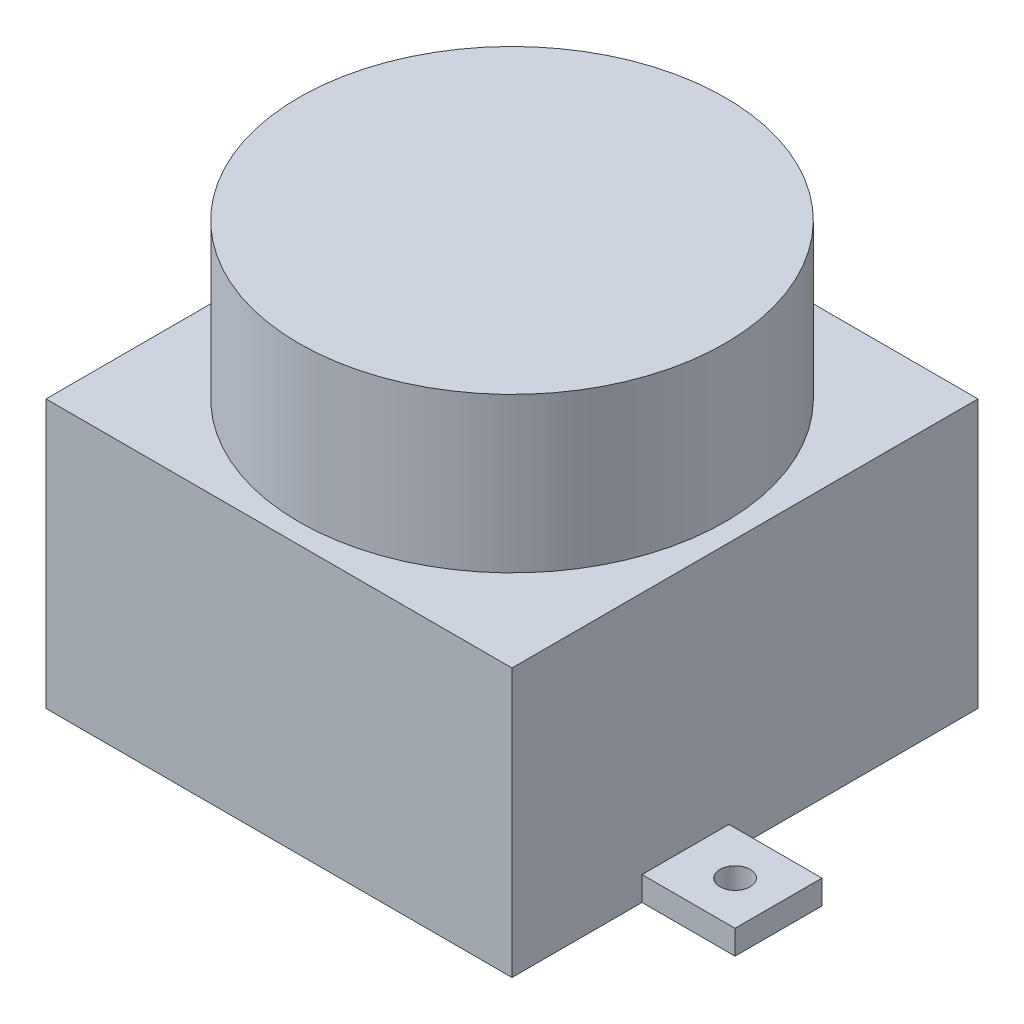
ISO-10303-21;
HEADER;
FILE_DESCRIPTION(('STEP AP214'),'2;1');
FILE_NAME('part.step','',(''),(''),'','','');
FILE_SCHEMA(('AUTOMOTIVE_DESIGN { 1 0 10303 214 1 1 1 1 }'));
ENDSEC;
DATA;
#1=APPLICATION_CONTEXT('core data for automotive mechanical design processes');
#2=APPLICATION_PROTOCOL_DEFINITION('international standard','automotive_design',2000,#1);
#3=PRODUCT_CONTEXT('',#1,'mechanical');
#4=PRODUCT('Part','Part','',(#3));
#5=PRODUCT_RELATED_PRODUCT_CATEGORY('part','',(#4));
#6=PRODUCT_DEFINITION_FORMATION('','',#4);
#7=PRODUCT_DEFINITION_CONTEXT('part definition',#1,'design');
#8=PRODUCT_DEFINITION('design','',#6,#7);
#9=PRODUCT_DEFINITION_SHAPE('','',#8);
#10=(LENGTH_UNIT() NAMED_UNIT(*) SI_UNIT(.MILLI.,.METRE.));
#11=(NAMED_UNIT(*) PLANE_ANGLE_UNIT() SI_UNIT($,.RADIAN.));
#12=(NAMED_UNIT(*) SI_UNIT($,.STERADIAN.) SOLID_ANGLE_UNIT());
#13=UNCERTAINTY_MEASURE_WITH_UNIT(LENGTH_MEASURE(1.E-05),#10,'distance_accuracy_value','');
#14=(GEOMETRIC_REPRESENTATION_CONTEXT(3) GLOBAL_UNCERTAINTY_ASSIGNED_CONTEXT((#13)) GLOBAL_UNIT_ASSIGNED_CONTEXT((#10,
#11,#12)) REPRESENTATION_CONTEXT('',''));
#15=CARTESIAN_POINT('',(0.,0.,0.));
#16=DIRECTION('',(0.,0.,1.));
#17=DIRECTION('',(1.,0.,0.));
#18=AXIS2_PLACEMENT_3D('',#15,#16,#17);
#19=CARTESIAN_POINT('',(-19.295,22.2,-19.295));
#20=DIRECTION('',(1.,0.,0.));
#21=DIRECTION('',(0.,0.,-1.));
#22=AXIS2_PLACEMENT_3D('',#19,#20,#21);
#23=PLANE('',#22);
#24=DIRECTION('',(0.,1.,0.));
#25=VECTOR('',#24,1.);
#26=CARTESIAN_POINT('',(-19.295,22.2,8.53));
#27=LINE('',#26,#25);
#28=CARTESIAN_POINT('',(-19.295,0.,8.53));
#29=VERTEX_POINT('',#28);
#30=CARTESIAN_POINT('',(-19.295,2.,8.53));
#31=VERTEX_POINT('',#30);
#32=EDGE_CURVE('E45',#29,#31,#27,.T.);
#33=ORIENTED_EDGE('',*,*,#32,.F.);
#34=DIRECTION('',(0.,0.,1.));
#35=VECTOR('',#34,1.);
#36=CARTESIAN_POINT('',(-19.295,0.,-19.295));
#37=LINE('',#36,#35);
#38=CARTESIAN_POINT('',(-19.295,0.,19.295));
#39=VERTEX_POINT('',#38);
#40=EDGE_CURVE('E169',#29,#39,#37,.T.);
#41=ORIENTED_EDGE('',*,*,#40,.T.);
#42=DIRECTION('',(0.,-1.,0.));
#43=VECTOR('',#42,1.);
#44=CARTESIAN_POINT('',(-19.295,22.2,19.295));
#45=LINE('',#44,#43);
#46=CARTESIAN_POINT('',(-19.295,22.2,19.295));
#47=VERTEX_POINT('',#46);
#48=EDGE_CURVE('E252',#47,#39,#45,.T.);
#49=ORIENTED_EDGE('',*,*,#48,.F.);
#50=DIRECTION('',(0.,0.,1.));
#51=VECTOR('',#50,1.);
#52=CARTESIAN_POINT('',(-19.295,22.2,-19.295));
#53=LINE('',#52,#51);
#54=CARTESIAN_POINT('',(-19.295,22.2,-19.295));
#55=VERTEX_POINT('',#54);
#56=EDGE_CURVE('E217',#55,#47,#53,.T.);
#57=ORIENTED_EDGE('',*,*,#56,.F.);
#58=DIRECTION('',(0.,-1.,0.));
#59=VECTOR('',#58,1.);
#60=CARTESIAN_POINT('',(-19.295,22.2,-19.295));
#61=LINE('',#60,#59);
#62=CARTESIAN_POINT('',(-19.295,0.,-19.295));
#63=VERTEX_POINT('',#62);
#64=EDGE_CURVE('E229',#55,#63,#61,.T.);
#65=ORIENTED_EDGE('',*,*,#64,.T.);
#66=CARTESIAN_POINT('',(-19.295,0.,1.33));
#67=VERTEX_POINT('',#66);
#68=EDGE_CURVE('E233',#63,#67,#37,.T.);
#69=ORIENTED_EDGE('',*,*,#68,.T.);
#70=DIRECTION('',(0.,-1.,0.));
#71=VECTOR('',#70,1.);
#72=CARTESIAN_POINT('',(-19.295,22.2,1.33));
#73=LINE('',#72,#71);
#74=CARTESIAN_POINT('',(-19.295,2.,1.33));
#75=VERTEX_POINT('',#74);
#76=EDGE_CURVE('E267',#75,#67,#73,.T.);
#77=ORIENTED_EDGE('',*,*,#76,.F.);
#78=DIRECTION('',(0.,0.,1.));
#79=VECTOR('',#78,1.);
#80=CARTESIAN_POINT('',(-19.295,2.,-19.295));
#81=LINE('',#80,#79);
#82=EDGE_CURVE('E270',#75,#31,#81,.T.);
#83=ORIENTED_EDGE('',*,*,#82,.T.);
#84=EDGE_LOOP('',(#33,#41,#49,#57,#65,#69,#77,#83));
#85=FACE_BOUND('',#84,.T.);
#86=ADVANCED_FACE('F39',(#85),#23,.F.);
#87=CARTESIAN_POINT('',(19.295,22.2,-19.295));
#88=DIRECTION('',(-1.,0.,0.));
#89=DIRECTION('',(0.,0.,1.));
#90=AXIS2_PLACEMENT_3D('',#87,#88,#89);
#91=PLANE('',#90);
#92=DIRECTION('',(0.,-1.,0.));
#93=VECTOR('',#92,1.);
#94=CARTESIAN_POINT('',(19.295,22.2,8.53));
#95=LINE('',#94,#93);
#96=CARTESIAN_POINT('',(19.295,2.,8.53));
#97=VERTEX_POINT('',#96);
#98=CARTESIAN_POINT('',(19.295,0.,8.53));
#99=VERTEX_POINT('',#98);
#100=EDGE_CURVE('E262',#97,#99,#95,.T.);
#101=ORIENTED_EDGE('',*,*,#100,.F.);
#102=DIRECTION('',(0.,0.,-1.));
#103=VECTOR('',#102,1.);
#104=CARTESIAN_POINT('',(19.295,2.,-19.295));
#105=LINE('',#104,#103);
#106=CARTESIAN_POINT('',(19.295,2.,1.33));
#107=VERTEX_POINT('',#106);
#108=EDGE_CURVE('E160',#97,#107,#105,.T.);
#109=ORIENTED_EDGE('',*,*,#108,.T.);
#110=DIRECTION('',(0.,1.,0.));
#111=VECTOR('',#110,1.);
#112=CARTESIAN_POINT('',(19.295,22.2,1.33));
#113=LINE('',#112,#111);
#114=CARTESIAN_POINT('',(19.295,0.,1.33));
#115=VERTEX_POINT('',#114);
#116=EDGE_CURVE('E265',#115,#107,#113,.T.);
#117=ORIENTED_EDGE('',*,*,#116,.F.);
#118=DIRECTION('',(0.,0.,-1.));
#119=VECTOR('',#118,1.);
#120=CARTESIAN_POINT('',(19.295,0.,-19.295));
#121=LINE('',#120,#119);
#122=CARTESIAN_POINT('',(19.295,0.,-19.295));
#123=VERTEX_POINT('',#122);
#124=EDGE_CURVE('E236',#115,#123,#121,.T.);
#125=ORIENTED_EDGE('',*,*,#124,.T.);
#126=DIRECTION('',(0.,-1.,0.));
#127=VECTOR('',#126,1.);
#128=CARTESIAN_POINT('',(19.295,22.2,-19.295));
#129=LINE('',#128,#127);
#130=CARTESIAN_POINT('',(19.295,22.2,-19.295));
#131=VERTEX_POINT('',#130);
#132=EDGE_CURVE('E244',#131,#123,#129,.T.);
#133=ORIENTED_EDGE('',*,*,#132,.F.);
#134=DIRECTION('',(0.,0.,-1.));
#135=VECTOR('',#134,1.);
#136=CARTESIAN_POINT('',(19.295,22.2,-19.295));
#137=LINE('',#136,#135);
#138=CARTESIAN_POINT('',(19.295,22.2,19.295));
#139=VERTEX_POINT('',#138);
#140=EDGE_CURVE('E228',#139,#131,#137,.T.);
#141=ORIENTED_EDGE('',*,*,#140,.F.);
#142=DIRECTION('',(0.,-1.,0.));
#143=VECTOR('',#142,1.);
#144=CARTESIAN_POINT('',(19.295,22.2,19.295));
#145=LINE('',#144,#143);
#146=CARTESIAN_POINT('',(19.295,0.,19.295));
#147=VERTEX_POINT('',#146);
#148=EDGE_CURVE('E247',#139,#147,#145,.T.);
#149=ORIENTED_EDGE('',*,*,#148,.T.);
#150=EDGE_CURVE('E240',#147,#99,#121,.T.);
#151=ORIENTED_EDGE('',*,*,#150,.T.);
#152=EDGE_LOOP('',(#101,#109,#117,#125,#133,#141,#149,#151));
#153=FACE_BOUND('',#152,.T.);
#154=ADVANCED_FACE('F336',(#153),#91,.F.);
#155=CARTESIAN_POINT('',(-19.295,22.2,-19.295));
#156=DIRECTION('',(0.,0.,1.));
#157=DIRECTION('',(1.,0.,0.));
#158=AXIS2_PLACEMENT_3D('',#155,#156,#157);
#159=PLANE('',#158);
#160=DIRECTION('',(0.,1.,0.));
#161=VECTOR('',#160,1.);
#162=CARTESIAN_POINT('',(-3.6,22.2,-19.295));
#163=LINE('',#162,#161);
#164=CARTESIAN_POINT('',(-3.6,0.,-19.295));
#165=VERTEX_POINT('',#164);
#166=CARTESIAN_POINT('',(-3.6,2.,-19.295));
#167=VERTEX_POINT('',#166);
#168=EDGE_CURVE('E256',#165,#167,#163,.T.);
#169=ORIENTED_EDGE('',*,*,#168,.F.);
#170=DIRECTION('',(-1.,0.,0.));
#171=VECTOR('',#170,1.);
#172=CARTESIAN_POINT('',(-19.295,0.,-19.295));
#173=LINE('',#172,#171);
#174=EDGE_CURVE('E239',#165,#63,#173,.T.);
#175=ORIENTED_EDGE('',*,*,#174,.T.);
#176=ORIENTED_EDGE('',*,*,#64,.F.);
#177=DIRECTION('',(-1.,0.,0.));
#178=VECTOR('',#177,1.);
#179=CARTESIAN_POINT('',(-19.295,22.2,-19.295));
#180=LINE('',#179,#178);
#181=EDGE_CURVE('E226',#131,#55,#180,.T.);
#182=ORIENTED_EDGE('',*,*,#181,.F.);
#183=ORIENTED_EDGE('',*,*,#132,.T.);
#184=CARTESIAN_POINT('',(3.6,0.,-19.295));
#185=VERTEX_POINT('',#184);
#186=EDGE_CURVE('E222',#123,#185,#173,.T.);
#187=ORIENTED_EDGE('',*,*,#186,.T.);
#188=DIRECTION('',(0.,-1.,0.));
#189=VECTOR('',#188,1.);
#190=CARTESIAN_POINT('',(3.6,22.2,-19.295));
#191=LINE('',#190,#189);
#192=CARTESIAN_POINT('',(3.6,2.,-19.295));
#193=VERTEX_POINT('',#192);
#194=EDGE_CURVE('E260',#193,#185,#191,.T.);
#195=ORIENTED_EDGE('',*,*,#194,.F.);
#196=DIRECTION('',(-1.,0.,0.));
#197=VECTOR('',#196,1.);
#198=CARTESIAN_POINT('',(-19.295,2.,-19.295));
#199=LINE('',#198,#197);
#200=EDGE_CURVE('E251',#193,#167,#199,.T.);
#201=ORIENTED_EDGE('',*,*,#200,.T.);
#202=EDGE_LOOP('',(#169,#175,#176,#182,#183,#187,#195,#201));
#203=FACE_BOUND('',#202,.T.);
#204=ADVANCED_FACE('F306',(#203),#159,.F.);
#205=CARTESIAN_POINT('',(-19.295,22.2,19.295));
#206=DIRECTION('',(0.,0.,-1.));
#207=DIRECTION('',(-1.,0.,0.));
#208=AXIS2_PLACEMENT_3D('',#205,#206,#207);
#209=PLANE('',#208);
#210=DIRECTION('',(1.,0.,0.));
#211=VECTOR('',#210,1.);
#212=CARTESIAN_POINT('',(-19.295,0.,19.295));
#213=LINE('',#212,#211);
#214=EDGE_CURVE('E234',#39,#147,#213,.T.);
#215=ORIENTED_EDGE('',*,*,#214,.T.);
#216=ORIENTED_EDGE('',*,*,#148,.F.);
#217=DIRECTION('',(1.,0.,0.));
#218=VECTOR('',#217,1.);
#219=CARTESIAN_POINT('',(-19.295,22.2,19.295));
#220=LINE('',#219,#218);
#221=EDGE_CURVE('E221',#47,#139,#220,.T.);
#222=ORIENTED_EDGE('',*,*,#221,.F.);
#223=ORIENTED_EDGE('',*,*,#48,.T.);
#224=EDGE_LOOP('',(#215,#216,#222,#223));
#225=FACE_BOUND('',#224,.T.);
#226=ADVANCED_FACE('F298',(#225),#209,.F.);
#227=CARTESIAN_POINT('',(0.,22.2,0.));
#228=DIRECTION('',(0.,1.,0.));
#229=DIRECTION('',(0.,0.,1.));
#230=AXIS2_PLACEMENT_3D('',#227,#228,#229);
#231=PLANE('',#230);
#232=CARTESIAN_POINT('',(0.,22.2,0.));
#233=DIRECTION('',(0.,1.,0.));
#234=DIRECTION('',(0.,0.,1.));
#235=AXIS2_PLACEMENT_3D('',#232,#233,#234);
#236=CIRCLE('',#235,17.645);
#237=CARTESIAN_POINT('',(0.,22.2,17.645));
#238=VERTEX_POINT('',#237);
#239=EDGE_CURVE('E11',#238,#238,#236,.T.);
#240=ORIENTED_EDGE('',*,*,#239,.F.);
#241=EDGE_LOOP('',(#240));
#242=FACE_BOUND('',#241,.T.);
#243=ORIENTED_EDGE('',*,*,#56,.T.);
#244=ORIENTED_EDGE('',*,*,#221,.T.);
#245=ORIENTED_EDGE('',*,*,#140,.T.);
#246=ORIENTED_EDGE('',*,*,#181,.T.);
#247=EDGE_LOOP('',(#243,#244,#245,#246));
#248=FACE_BOUND('',#247,.T.);
#249=ADVANCED_FACE('F297',(#242,#248),#231,.T.);
#250=CARTESIAN_POINT('',(0.,0.,0.));
#251=DIRECTION('',(0.,1.,0.));
#252=DIRECTION('',(0.,0.,1.));
#253=AXIS2_PLACEMENT_3D('',#250,#251,#252);
#254=PLANE('',#253);
#255=CARTESIAN_POINT('',(23.4,0.,4.93));
#256=DIRECTION('',(0.,1.,0.));
#257=DIRECTION('',(0.,0.,1.));
#258=AXIS2_PLACEMENT_3D('',#255,#256,#257);
#259=CIRCLE('',#258,1.25);
#260=CARTESIAN_POINT('',(23.4,0.,6.18));
#261=VERTEX_POINT('',#260);
#262=EDGE_CURVE('E542',#261,#261,#259,.T.);
#263=ORIENTED_EDGE('',*,*,#262,.T.);
#264=EDGE_LOOP('',(#263));
#265=FACE_BOUND('',#264,.T.);
#266=CARTESIAN_POINT('',(-23.4,0.,4.93));
#267=DIRECTION('',(0.,1.,0.));
#268=DIRECTION('',(0.,0.,1.));
#269=AXIS2_PLACEMENT_3D('',#266,#267,#268);
#270=CIRCLE('',#269,1.25);
#271=CARTESIAN_POINT('',(-23.4,0.,6.18));
#272=VERTEX_POINT('',#271);
#273=EDGE_CURVE('E544',#272,#272,#270,.T.);
#274=ORIENTED_EDGE('',*,*,#273,.T.);
#275=EDGE_LOOP('',(#274));
#276=FACE_BOUND('',#275,.T.);
#277=CARTESIAN_POINT('',(0.,0.,-23.39));
#278=DIRECTION('',(0.,1.,0.));
#279=DIRECTION('',(0.,0.,1.));
#280=AXIS2_PLACEMENT_3D('',#277,#278,#279);
#281=CIRCLE('',#280,1.25);
#282=CARTESIAN_POINT('',(0.,0.,-22.14));
#283=VERTEX_POINT('',#282);
#284=EDGE_CURVE('E541',#283,#283,#281,.T.);
#285=ORIENTED_EDGE('',*,*,#284,.T.);
#286=EDGE_LOOP('',(#285));
#287=FACE_BOUND('',#286,.T.);
#288=ORIENTED_EDGE('',*,*,#124,.F.);
#289=DIRECTION('',(-1.,0.,0.));
#290=VECTOR('',#289,1.);
#291=CARTESIAN_POINT('',(19.,0.,1.33));
#292=LINE('',#291,#290);
#293=CARTESIAN_POINT('',(27.,0.,1.33));
#294=VERTEX_POINT('',#293);
#295=EDGE_CURVE('E159',#294,#115,#292,.T.);
#296=ORIENTED_EDGE('',*,*,#295,.F.);
#297=DIRECTION('',(0.,0.,-1.));
#298=VECTOR('',#297,1.);
#299=CARTESIAN_POINT('',(27.,0.,1.33));
#300=LINE('',#299,#298);
#301=CARTESIAN_POINT('',(27.,0.,8.53));
#302=VERTEX_POINT('',#301);
#303=EDGE_CURVE('E177',#302,#294,#300,.T.);
#304=ORIENTED_EDGE('',*,*,#303,.F.);
#305=DIRECTION('',(1.,0.,0.));
#306=VECTOR('',#305,1.);
#307=CARTESIAN_POINT('',(19.,0.,8.53));
#308=LINE('',#307,#306);
#309=EDGE_CURVE('E168',#99,#302,#308,.T.);
#310=ORIENTED_EDGE('',*,*,#309,.F.);
#311=ORIENTED_EDGE('',*,*,#150,.F.);
#312=ORIENTED_EDGE('',*,*,#214,.F.);
#313=ORIENTED_EDGE('',*,*,#40,.F.);
#314=DIRECTION('',(1.,0.,0.));
#315=VECTOR('',#314,1.);
#316=CARTESIAN_POINT('',(-27.,0.,8.53));
#317=LINE('',#316,#315);
#318=CARTESIAN_POINT('',(-27.,0.,8.53));
#319=VERTEX_POINT('',#318);
#320=EDGE_CURVE('E191',#319,#29,#317,.T.);
#321=ORIENTED_EDGE('',*,*,#320,.F.);
#322=DIRECTION('',(0.,0.,1.));
#323=VECTOR('',#322,1.);
#324=CARTESIAN_POINT('',(-27.,0.,1.33));
#325=LINE('',#324,#323);
#326=CARTESIAN_POINT('',(-27.,0.,1.33));
#327=VERTEX_POINT('',#326);
#328=EDGE_CURVE('E179',#327,#319,#325,.T.);
#329=ORIENTED_EDGE('',*,*,#328,.F.);
#330=DIRECTION('',(-1.,0.,0.));
#331=VECTOR('',#330,1.);
#332=CARTESIAN_POINT('',(-27.,0.,1.33));
#333=LINE('',#332,#331);
#334=EDGE_CURVE('E195',#67,#327,#333,.T.);
#335=ORIENTED_EDGE('',*,*,#334,.F.);
#336=ORIENTED_EDGE('',*,*,#68,.F.);
#337=ORIENTED_EDGE('',*,*,#174,.F.);
#338=DIRECTION('',(0.,0.,1.));
#339=VECTOR('',#338,1.);
#340=CARTESIAN_POINT('',(-3.6,0.,-27.));
#341=LINE('',#340,#339);
#342=CARTESIAN_POINT('',(-3.6,0.,-27.));
#343=VERTEX_POINT('',#342);
#344=EDGE_CURVE('E189',#343,#165,#341,.T.);
#345=ORIENTED_EDGE('',*,*,#344,.F.);
#346=DIRECTION('',(-1.,0.,0.));
#347=VECTOR('',#346,1.);
#348=CARTESIAN_POINT('',(-3.6,0.,-27.));
#349=LINE('',#348,#347);
#350=CARTESIAN_POINT('',(3.6,0.,-27.));
#351=VERTEX_POINT('',#350);
#352=EDGE_CURVE('E208',#351,#343,#349,.T.);
#353=ORIENTED_EDGE('',*,*,#352,.F.);
#354=DIRECTION('',(0.,0.,-1.));
#355=VECTOR('',#354,1.);
#356=CARTESIAN_POINT('',(3.6,0.,-27.));
#357=LINE('',#356,#355);
#358=EDGE_CURVE('E215',#185,#351,#357,.T.);
#359=ORIENTED_EDGE('',*,*,#358,.F.);
#360=ORIENTED_EDGE('',*,*,#186,.F.);
#361=EDGE_LOOP('',(#288,#296,#304,#310,#311,#312,#313,#321,#329,#335,#336,#337,#345,#353,#359,#360));
#362=FACE_BOUND('',#361,.T.);
#363=ADVANCED_FACE('F287',(#265,#276,#287,#362),#254,.F.);
#364=CARTESIAN_POINT('',(-3.6,2.,-27.));
#365=DIRECTION('',(1.,0.,0.));
#366=DIRECTION('',(0.,0.,-1.));
#367=AXIS2_PLACEMENT_3D('',#364,#365,#366);
#368=PLANE('',#367);
#369=ORIENTED_EDGE('',*,*,#344,.T.);
#370=ORIENTED_EDGE('',*,*,#168,.T.);
#371=DIRECTION('',(0.,0.,1.));
#372=VECTOR('',#371,1.);
#373=CARTESIAN_POINT('',(-3.6,2.,-27.));
#374=LINE('',#373,#372);
#375=CARTESIAN_POINT('',(-3.6,2.,-27.));
#376=VERTEX_POINT('',#375);
#377=EDGE_CURVE('E214',#376,#167,#374,.T.);
#378=ORIENTED_EDGE('',*,*,#377,.F.);
#379=DIRECTION('',(0.,-1.,0.));
#380=VECTOR('',#379,1.);
#381=CARTESIAN_POINT('',(-3.6,2.,-27.));
#382=LINE('',#381,#380);
#383=EDGE_CURVE('E204',#376,#343,#382,.T.);
#384=ORIENTED_EDGE('',*,*,#383,.T.);
#385=EDGE_LOOP('',(#369,#370,#378,#384));
#386=FACE_BOUND('',#385,.T.);
#387=ADVANCED_FACE('F315',(#386),#368,.F.);
#388=CARTESIAN_POINT('',(3.6,2.,-27.));
#389=DIRECTION('',(-1.,0.,0.));
#390=DIRECTION('',(0.,0.,1.));
#391=AXIS2_PLACEMENT_3D('',#388,#389,#390);
#392=PLANE('',#391);
#393=DIRECTION('',(0.,0.,-1.));
#394=VECTOR('',#393,1.);
#395=CARTESIAN_POINT('',(3.6,2.,-27.));
#396=LINE('',#395,#394);
#397=CARTESIAN_POINT('',(3.6,2.,-27.));
#398=VERTEX_POINT('',#397);
#399=EDGE_CURVE('E216',#193,#398,#396,.T.);
#400=ORIENTED_EDGE('',*,*,#399,.F.);
#401=ORIENTED_EDGE('',*,*,#194,.T.);
#402=ORIENTED_EDGE('',*,*,#358,.T.);
#403=DIRECTION('',(0.,-1.,0.));
#404=VECTOR('',#403,1.);
#405=CARTESIAN_POINT('',(3.6,2.,-27.));
#406=LINE('',#405,#404);
#407=EDGE_CURVE('E205',#398,#351,#406,.T.);
#408=ORIENTED_EDGE('',*,*,#407,.F.);
#409=EDGE_LOOP('',(#400,#401,#402,#408));
#410=FACE_BOUND('',#409,.T.);
#411=ADVANCED_FACE('F322',(#410),#392,.F.);
#412=CARTESIAN_POINT('',(0.,2.,0.));
#413=DIRECTION('',(0.,1.,0.));
#414=DIRECTION('',(0.,0.,1.));
#415=AXIS2_PLACEMENT_3D('',#412,#413,#414);
#416=PLANE('',#415);
#417=CARTESIAN_POINT('',(0.,2.,-23.39));
#418=DIRECTION('',(0.,1.,0.));
#419=DIRECTION('',(0.,0.,1.));
#420=AXIS2_PLACEMENT_3D('',#417,#418,#419);
#421=CIRCLE('',#420,1.25);
#422=CARTESIAN_POINT('',(0.,2.,-22.14));
#423=VERTEX_POINT('',#422);
#424=EDGE_CURVE('E546',#423,#423,#421,.T.);
#425=ORIENTED_EDGE('',*,*,#424,.F.);
#426=EDGE_LOOP('',(#425));
#427=FACE_BOUND('',#426,.T.);
#428=ORIENTED_EDGE('',*,*,#200,.F.);
#429=ORIENTED_EDGE('',*,*,#399,.T.);
#430=DIRECTION('',(-1.,0.,0.));
#431=VECTOR('',#430,1.);
#432=CARTESIAN_POINT('',(-3.6,2.,-27.));
#433=LINE('',#432,#431);
#434=EDGE_CURVE('E209',#398,#376,#433,.T.);
#435=ORIENTED_EDGE('',*,*,#434,.T.);
#436=ORIENTED_EDGE('',*,*,#377,.T.);
#437=EDGE_LOOP('',(#428,#429,#435,#436));
#438=FACE_BOUND('',#437,.T.);
#439=ADVANCED_FACE('F319',(#427,#438),#416,.T.);
#440=CARTESIAN_POINT('',(-3.6,2.,-27.));
#441=DIRECTION('',(0.,0.,1.));
#442=DIRECTION('',(1.,0.,0.));
#443=AXIS2_PLACEMENT_3D('',#440,#441,#442);
#444=PLANE('',#443);
#445=ORIENTED_EDGE('',*,*,#352,.T.);
#446=ORIENTED_EDGE('',*,*,#383,.F.);
#447=ORIENTED_EDGE('',*,*,#434,.F.);
#448=ORIENTED_EDGE('',*,*,#407,.T.);
#449=EDGE_LOOP('',(#445,#446,#447,#448));
#450=FACE_BOUND('',#449,.T.);
#451=ADVANCED_FACE('F321',(#450),#444,.F.);
#452=CARTESIAN_POINT('',(19.,2.,8.53));
#453=DIRECTION('',(0.,0.,-1.));
#454=DIRECTION('',(-1.,0.,0.));
#455=AXIS2_PLACEMENT_3D('',#452,#453,#454);
#456=PLANE('',#455);
#457=DIRECTION('',(1.,0.,0.));
#458=VECTOR('',#457,1.);
#459=CARTESIAN_POINT('',(19.,2.,8.53));
#460=LINE('',#459,#458);
#461=CARTESIAN_POINT('',(27.,2.,8.53));
#462=VERTEX_POINT('',#461);
#463=EDGE_CURVE('E148',#97,#462,#460,.T.);
#464=ORIENTED_EDGE('',*,*,#463,.F.);
#465=ORIENTED_EDGE('',*,*,#100,.T.);
#466=ORIENTED_EDGE('',*,*,#309,.T.);
#467=DIRECTION('',(0.,-1.,0.));
#468=VECTOR('',#467,1.);
#469=CARTESIAN_POINT('',(27.,2.,8.53));
#470=LINE('',#469,#468);
#471=EDGE_CURVE('E161',#462,#302,#470,.T.);
#472=ORIENTED_EDGE('',*,*,#471,.F.);
#473=EDGE_LOOP('',(#464,#465,#466,#472));
#474=FACE_BOUND('',#473,.T.);
#475=ADVANCED_FACE('F165',(#474),#456,.F.);
#476=CARTESIAN_POINT('',(19.,2.,1.33));
#477=DIRECTION('',(0.,0.,1.));
#478=DIRECTION('',(1.,0.,0.));
#479=AXIS2_PLACEMENT_3D('',#476,#477,#478);
#480=PLANE('',#479);
#481=ORIENTED_EDGE('',*,*,#295,.T.);
#482=ORIENTED_EDGE('',*,*,#116,.T.);
#483=DIRECTION('',(-1.,0.,0.));
#484=VECTOR('',#483,1.);
#485=CARTESIAN_POINT('',(19.,2.,1.33));
#486=LINE('',#485,#484);
#487=CARTESIAN_POINT('',(27.,2.,1.33));
#488=VERTEX_POINT('',#487);
#489=EDGE_CURVE('E65',#488,#107,#486,.T.);
#490=ORIENTED_EDGE('',*,*,#489,.F.);
#491=DIRECTION('',(0.,-1.,0.));
#492=VECTOR('',#491,1.);
#493=CARTESIAN_POINT('',(27.,2.,1.33));
#494=LINE('',#493,#492);
#495=EDGE_CURVE('E167',#488,#294,#494,.T.);
#496=ORIENTED_EDGE('',*,*,#495,.T.);
#497=EDGE_LOOP('',(#481,#482,#490,#496));
#498=FACE_BOUND('',#497,.T.);
#499=ADVANCED_FACE('F333',(#498),#480,.F.);
#500=CARTESIAN_POINT('',(0.,2.,0.));
#501=DIRECTION('',(0.,1.,0.));
#502=DIRECTION('',(0.,0.,1.));
#503=AXIS2_PLACEMENT_3D('',#500,#501,#502);
#504=PLANE('',#503);
#505=CARTESIAN_POINT('',(23.4,2.,4.93));
#506=DIRECTION('',(0.,1.,0.));
#507=DIRECTION('',(0.,0.,1.));
#508=AXIS2_PLACEMENT_3D('',#505,#506,#507);
#509=CIRCLE('',#508,1.25);
#510=CARTESIAN_POINT('',(23.4,2.,6.18));
#511=VERTEX_POINT('',#510);
#512=EDGE_CURVE('E207',#511,#511,#509,.T.);
#513=ORIENTED_EDGE('',*,*,#512,.F.);
#514=EDGE_LOOP('',(#513));
#515=FACE_BOUND('',#514,.T.);
#516=ORIENTED_EDGE('',*,*,#108,.F.);
#517=ORIENTED_EDGE('',*,*,#463,.T.);
#518=DIRECTION('',(0.,0.,-1.));
#519=VECTOR('',#518,1.);
#520=CARTESIAN_POINT('',(27.,2.,1.33));
#521=LINE('',#520,#519);
#522=EDGE_CURVE('E153',#462,#488,#521,.T.);
#523=ORIENTED_EDGE('',*,*,#522,.T.);
#524=ORIENTED_EDGE('',*,*,#489,.T.);
#525=EDGE_LOOP('',(#516,#517,#523,#524));
#526=FACE_BOUND('',#525,.T.);
#527=ADVANCED_FACE('F151',(#515,#526),#504,.T.);
#528=CARTESIAN_POINT('',(27.,2.,1.33));
#529=DIRECTION('',(-1.,0.,0.));
#530=DIRECTION('',(0.,0.,1.));
#531=AXIS2_PLACEMENT_3D('',#528,#529,#530);
#532=PLANE('',#531);
#533=ORIENTED_EDGE('',*,*,#303,.T.);
#534=ORIENTED_EDGE('',*,*,#495,.F.);
#535=ORIENTED_EDGE('',*,*,#522,.F.);
#536=ORIENTED_EDGE('',*,*,#471,.T.);
#537=EDGE_LOOP('',(#533,#534,#535,#536));
#538=FACE_BOUND('',#537,.T.);
#539=ADVANCED_FACE('F175',(#538),#532,.F.);
#540=CARTESIAN_POINT('',(-27.,2.,8.53));
#541=DIRECTION('',(0.,0.,-1.));
#542=DIRECTION('',(-1.,0.,0.));
#543=AXIS2_PLACEMENT_3D('',#540,#541,#542);
#544=PLANE('',#543);
#545=ORIENTED_EDGE('',*,*,#320,.T.);
#546=ORIENTED_EDGE('',*,*,#32,.T.);
#547=DIRECTION('',(1.,0.,0.));
#548=VECTOR('',#547,1.);
#549=CARTESIAN_POINT('',(-27.,2.,8.53));
#550=LINE('',#549,#548);
#551=CARTESIAN_POINT('',(-27.,2.,8.53));
#552=VERTEX_POINT('',#551);
#553=EDGE_CURVE('E53',#552,#31,#550,.T.);
#554=ORIENTED_EDGE('',*,*,#553,.F.);
#555=DIRECTION('',(0.,-1.,0.));
#556=VECTOR('',#555,1.);
#557=CARTESIAN_POINT('',(-27.,2.,8.53));
#558=LINE('',#557,#556);
#559=EDGE_CURVE('E183',#552,#319,#558,.T.);
#560=ORIENTED_EDGE('',*,*,#559,.T.);
#561=EDGE_LOOP('',(#545,#546,#554,#560));
#562=FACE_BOUND('',#561,.T.);
#563=ADVANCED_FACE('F277',(#562),#544,.F.);
#564=CARTESIAN_POINT('',(-27.,2.,1.33));
#565=DIRECTION('',(0.,0.,1.));
#566=DIRECTION('',(1.,0.,0.));
#567=AXIS2_PLACEMENT_3D('',#564,#565,#566);
#568=PLANE('',#567);
#569=DIRECTION('',(-1.,0.,0.));
#570=VECTOR('',#569,1.);
#571=CARTESIAN_POINT('',(-27.,2.,1.33));
#572=LINE('',#571,#570);
#573=CARTESIAN_POINT('',(-27.,2.,1.33));
#574=VERTEX_POINT('',#573);
#575=EDGE_CURVE('E192',#75,#574,#572,.T.);
#576=ORIENTED_EDGE('',*,*,#575,.F.);
#577=ORIENTED_EDGE('',*,*,#76,.T.);
#578=ORIENTED_EDGE('',*,*,#334,.T.);
#579=DIRECTION('',(0.,-1.,0.));
#580=VECTOR('',#579,1.);
#581=CARTESIAN_POINT('',(-27.,2.,1.33));
#582=LINE('',#581,#580);
#583=EDGE_CURVE('E190',#574,#327,#582,.T.);
#584=ORIENTED_EDGE('',*,*,#583,.F.);
#585=EDGE_LOOP('',(#576,#577,#578,#584));
#586=FACE_BOUND('',#585,.T.);
#587=ADVANCED_FACE('F284',(#586),#568,.F.);
#588=CARTESIAN_POINT('',(0.,2.,0.));
#589=DIRECTION('',(0.,1.,0.));
#590=DIRECTION('',(0.,0.,1.));
#591=AXIS2_PLACEMENT_3D('',#588,#589,#590);
#592=PLANE('',#591);
#593=CARTESIAN_POINT('',(-23.4,2.,4.93));
#594=DIRECTION('',(0.,1.,0.));
#595=DIRECTION('',(0.,0.,1.));
#596=AXIS2_PLACEMENT_3D('',#593,#594,#595);
#597=CIRCLE('',#596,1.25);
#598=CARTESIAN_POINT('',(-23.4,2.,6.18));
#599=VERTEX_POINT('',#598);
#600=EDGE_CURVE('E538',#599,#599,#597,.T.);
#601=ORIENTED_EDGE('',*,*,#600,.F.);
#602=EDGE_LOOP('',(#601));
#603=FACE_BOUND('',#602,.T.);
#604=ORIENTED_EDGE('',*,*,#82,.F.);
#605=ORIENTED_EDGE('',*,*,#575,.T.);
#606=DIRECTION('',(0.,0.,1.));
#607=VECTOR('',#606,1.);
#608=CARTESIAN_POINT('',(-27.,2.,1.33));
#609=LINE('',#608,#607);
#610=EDGE_CURVE('E193',#574,#552,#609,.T.);
#611=ORIENTED_EDGE('',*,*,#610,.T.);
#612=ORIENTED_EDGE('',*,*,#553,.T.);
#613=EDGE_LOOP('',(#604,#605,#611,#612));
#614=FACE_BOUND('',#613,.T.);
#615=ADVANCED_FACE('F276',(#603,#614),#592,.T.);
#616=CARTESIAN_POINT('',(-27.,2.,1.33));
#617=DIRECTION('',(1.,0.,0.));
#618=DIRECTION('',(0.,0.,-1.));
#619=AXIS2_PLACEMENT_3D('',#616,#617,#618);
#620=PLANE('',#619);
#621=ORIENTED_EDGE('',*,*,#328,.T.);
#622=ORIENTED_EDGE('',*,*,#559,.F.);
#623=ORIENTED_EDGE('',*,*,#610,.F.);
#624=ORIENTED_EDGE('',*,*,#583,.T.);
#625=EDGE_LOOP('',(#621,#622,#623,#624));
#626=FACE_BOUND('',#625,.T.);
#627=ADVANCED_FACE('F288',(#626),#620,.F.);
#628=CARTESIAN_POINT('',(-23.4,2.,4.93));
#629=DIRECTION('',(0.,-1.,0.));
#630=DIRECTION('',(0.,0.,-1.));
#631=AXIS2_PLACEMENT_3D('',#628,#629,#630);
#632=CYLINDRICAL_SURFACE('',#631,1.25);
#633=ORIENTED_EDGE('',*,*,#600,.T.);
#634=EDGE_LOOP('',(#633));
#635=FACE_BOUND('',#634,.T.);
#636=ORIENTED_EDGE('',*,*,#273,.F.);
#637=EDGE_LOOP('',(#636));
#638=FACE_BOUND('',#637,.T.);
#639=ADVANCED_FACE('F379',(#635,#638),#632,.F.);
#640=CARTESIAN_POINT('',(23.4,2.,4.93));
#641=DIRECTION('',(0.,-1.,0.));
#642=DIRECTION('',(0.,0.,-1.));
#643=AXIS2_PLACEMENT_3D('',#640,#641,#642);
#644=CYLINDRICAL_SURFACE('',#643,1.25);
#645=ORIENTED_EDGE('',*,*,#512,.T.);
#646=EDGE_LOOP('',(#645));
#647=FACE_BOUND('',#646,.T.);
#648=ORIENTED_EDGE('',*,*,#262,.F.);
#649=EDGE_LOOP('',(#648));
#650=FACE_BOUND('',#649,.T.);
#651=ADVANCED_FACE('F373',(#647,#650),#644,.F.);
#652=CARTESIAN_POINT('',(0.,2.,-23.39));
#653=DIRECTION('',(0.,-1.,0.));
#654=DIRECTION('',(0.,0.,-1.));
#655=AXIS2_PLACEMENT_3D('',#652,#653,#654);
#656=CYLINDRICAL_SURFACE('',#655,1.25);
#657=ORIENTED_EDGE('',*,*,#424,.T.);
#658=EDGE_LOOP('',(#657));
#659=FACE_BOUND('',#658,.T.);
#660=ORIENTED_EDGE('',*,*,#284,.F.);
#661=EDGE_LOOP('',(#660));
#662=FACE_BOUND('',#661,.T.);
#663=ADVANCED_FACE('F362',(#659,#662),#656,.F.);
#664=CARTESIAN_POINT('',(0.,35.,0.));
#665=DIRECTION('',(0.,-1.,0.));
#666=DIRECTION('',(0.,0.,-1.));
#667=AXIS2_PLACEMENT_3D('',#664,#665,#666);
#668=CYLINDRICAL_SURFACE('',#667,17.645);
#669=CARTESIAN_POINT('',(0.,35.,0.));
#670=DIRECTION('',(0.,1.,0.));
#671=DIRECTION('',(0.,0.,1.));
#672=AXIS2_PLACEMENT_3D('',#669,#670,#671);
#673=CIRCLE('',#672,17.645);
#674=CARTESIAN_POINT('',(0.,35.,17.645));
#675=VERTEX_POINT('',#674);
#676=EDGE_CURVE('E552',#675,#675,#673,.T.);
#677=ORIENTED_EDGE('',*,*,#676,.F.);
#678=EDGE_LOOP('',(#677));
#679=FACE_BOUND('',#678,.T.);
#680=ORIENTED_EDGE('',*,*,#239,.T.);
#681=EDGE_LOOP('',(#680));
#682=FACE_BOUND('',#681,.T.);
#683=ADVANCED_FACE('F361',(#679,#682),#668,.T.);
#684=CARTESIAN_POINT('',(0.,35.,0.));
#685=DIRECTION('',(0.,1.,0.));
#686=DIRECTION('',(0.,0.,1.));
#687=AXIS2_PLACEMENT_3D('',#684,#685,#686);
#688=PLANE('',#687);
#689=ORIENTED_EDGE('',*,*,#676,.T.);
#690=EDGE_LOOP('',(#689));
#691=FACE_BOUND('',#690,.T.);
#692=ADVANCED_FACE('F364',(#691),#688,.T.);
#693=CLOSED_SHELL('',(#86,#154,#204,#226,#249,#363,#387,#411,#439,#451,#475,#499,#527,#539,#563,
#587,#615,#627,#639,#651,#663,#683,#692));
#694=MANIFOLD_SOLID_BREP('B2',#693);
#695=ADVANCED_BREP_SHAPE_REPRESENTATION('',(#18,#694),#14);
#696=SHAPE_DEFINITION_REPRESENTATION(#9,#695);
ENDSEC;
END-ISO-10303-21;
